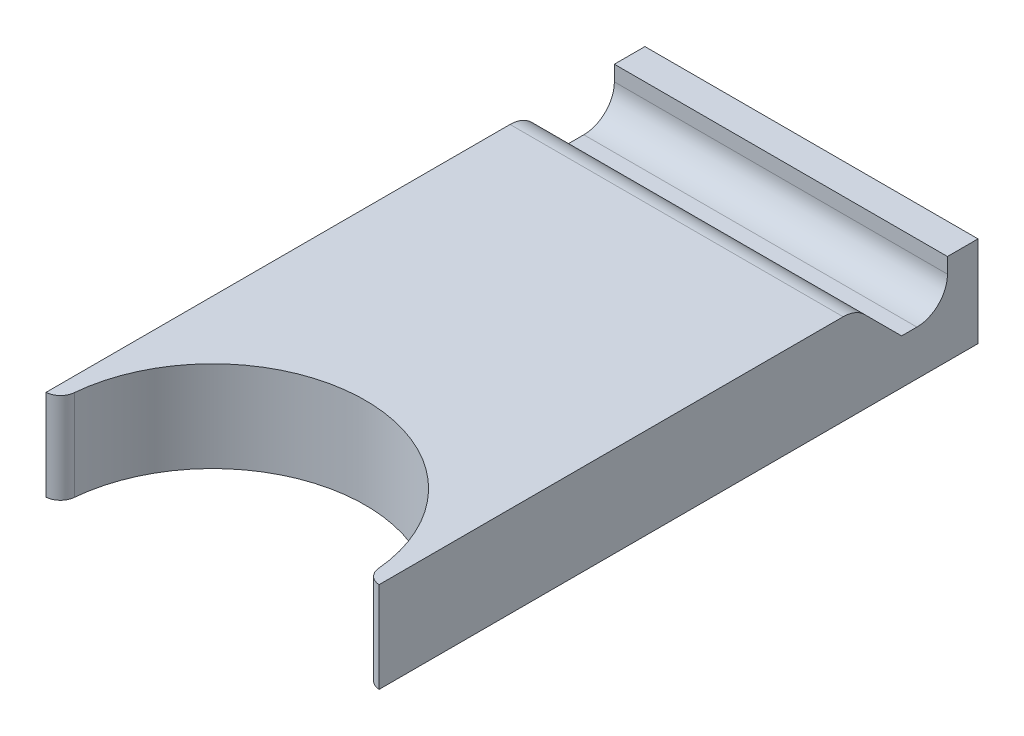
ISO-10303-21;
HEADER;
FILE_DESCRIPTION(('STEP AP214'),'2;1');
FILE_NAME('part.step','',(''),(''),'','','');
FILE_SCHEMA(('AUTOMOTIVE_DESIGN { 1 0 10303 214 1 1 1 1 }'));
ENDSEC;
DATA;
#1=APPLICATION_CONTEXT('core data for automotive mechanical design processes');
#2=APPLICATION_PROTOCOL_DEFINITION('international standard','automotive_design',2000,#1);
#3=PRODUCT_CONTEXT('',#1,'mechanical');
#4=PRODUCT('Part','Part','',(#3));
#5=PRODUCT_RELATED_PRODUCT_CATEGORY('part','',(#4));
#6=PRODUCT_DEFINITION_FORMATION('','',#4);
#7=PRODUCT_DEFINITION_CONTEXT('part definition',#1,'design');
#8=PRODUCT_DEFINITION('design','',#6,#7);
#9=PRODUCT_DEFINITION_SHAPE('','',#8);
#10=(LENGTH_UNIT() NAMED_UNIT(*) SI_UNIT(.MILLI.,.METRE.));
#11=(NAMED_UNIT(*) PLANE_ANGLE_UNIT() SI_UNIT($,.RADIAN.));
#12=(NAMED_UNIT(*) SI_UNIT($,.STERADIAN.) SOLID_ANGLE_UNIT());
#13=UNCERTAINTY_MEASURE_WITH_UNIT(LENGTH_MEASURE(1.E-05),#10,'distance_accuracy_value','');
#14=(GEOMETRIC_REPRESENTATION_CONTEXT(3) GLOBAL_UNCERTAINTY_ASSIGNED_CONTEXT((#13)) GLOBAL_UNIT_ASSIGNED_CONTEXT((#10,
#11,#12)) REPRESENTATION_CONTEXT('',''));
#15=CARTESIAN_POINT('',(0.,0.,0.));
#16=DIRECTION('',(0.,0.,1.));
#17=DIRECTION('',(1.,0.,0.));
#18=AXIS2_PLACEMENT_3D('',#15,#16,#17);
#19=CARTESIAN_POINT('',(0.,2.97,0.));
#20=DIRECTION('',(0.,1.,0.));
#21=DIRECTION('',(0.,0.,1.));
#22=AXIS2_PLACEMENT_3D('',#19,#20,#21);
#23=PLANE('',#22);
#24=DIRECTION('',(-1.,0.,0.));
#25=VECTOR('',#24,1.);
#26=CARTESIAN_POINT('',(-5.45,2.97,-18.6));
#27=LINE('',#26,#25);
#28=CARTESIAN_POINT('',(5.45,2.97,-18.6));
#29=VERTEX_POINT('',#28);
#30=CARTESIAN_POINT('',(-5.45,2.97,-18.6));
#31=VERTEX_POINT('',#30);
#32=EDGE_CURVE('E124',#29,#31,#27,.T.);
#33=ORIENTED_EDGE('',*,*,#32,.F.);
#34=DIRECTION('',(0.,0.,-1.));
#35=VECTOR('',#34,1.);
#36=CARTESIAN_POINT('',(5.45,2.97,0.));
#37=LINE('',#36,#35);
#38=CARTESIAN_POINT('',(5.45,2.97,-19.6));
#39=VERTEX_POINT('',#38);
#40=EDGE_CURVE('E131',#29,#39,#37,.T.);
#41=ORIENTED_EDGE('',*,*,#40,.T.);
#42=DIRECTION('',(-1.,0.,0.));
#43=VECTOR('',#42,1.);
#44=CARTESIAN_POINT('',(-5.45,2.97,-19.6));
#45=LINE('',#44,#43);
#46=CARTESIAN_POINT('',(-5.45,2.97,-19.6));
#47=VERTEX_POINT('',#46);
#48=EDGE_CURVE('E146',#39,#47,#45,.T.);
#49=ORIENTED_EDGE('',*,*,#48,.T.);
#50=DIRECTION('',(0.,0.,1.));
#51=VECTOR('',#50,1.);
#52=CARTESIAN_POINT('',(-5.45,2.97,0.));
#53=LINE('',#52,#51);
#54=EDGE_CURVE('E134',#47,#31,#53,.T.);
#55=ORIENTED_EDGE('',*,*,#54,.T.);
#56=EDGE_LOOP('',(#33,#41,#49,#55));
#57=FACE_BOUND('',#56,.T.);
#58=ADVANCED_FACE('F35',(#57),#23,.T.);
#59=CARTESIAN_POINT('',(-5.45,2.97,0.));
#60=DIRECTION('',(1.,0.,0.));
#61=DIRECTION('',(0.,0.,-1.));
#62=AXIS2_PLACEMENT_3D('',#59,#60,#61);
#63=PLANE('',#62);
#64=CARTESIAN_POINT('',(-5.45,2.97,-15.1857864376269));
#65=VERTEX_POINT('',#64);
#66=CARTESIAN_POINT('',(-5.45,2.97,0.));
#67=VERTEX_POINT('',#66);
#68=EDGE_CURVE('E163',#65,#67,#53,.T.);
#69=ORIENTED_EDGE('',*,*,#68,.F.);
#70=CARTESIAN_POINT('',(-5.45,1.97,-15.1857864376269));
#71=DIRECTION('',(1.,0.,0.));
#72=DIRECTION('',(0.,0.,-1.));
#73=AXIS2_PLACEMENT_3D('',#70,#71,#72);
#74=CIRCLE('',#73,1.);
#75=CARTESIAN_POINT('',(-5.45,2.67710678118654,-15.8928932188134));
#76=VERTEX_POINT('',#75);
#77=EDGE_CURVE('E197',#65,#76,#74,.F.);
#78=ORIENTED_EDGE('',*,*,#77,.T.);
#79=DIRECTION('',(0.,-0.707106781186551,-0.707106781186544));
#80=VECTOR('',#79,1.);
#81=CARTESIAN_POINT('',(-5.45,0.969999999999965,-17.6));
#82=LINE('',#81,#80);
#83=CARTESIAN_POINT('',(-5.45,1.47,-17.1));
#84=VERTEX_POINT('',#83);
#85=EDGE_CURVE('E188',#76,#84,#82,.T.);
#86=ORIENTED_EDGE('',*,*,#85,.T.);
#87=DIRECTION('',(0.,0.,1.));
#88=VECTOR('',#87,1.);
#89=CARTESIAN_POINT('',(-5.45,1.47,-18.6));
#90=LINE('',#89,#88);
#91=CARTESIAN_POINT('',(-5.45,1.47,-17.6));
#92=VERTEX_POINT('',#91);
#93=EDGE_CURVE('E135',#92,#84,#90,.T.);
#94=ORIENTED_EDGE('',*,*,#93,.F.);
#95=CARTESIAN_POINT('',(-5.45,2.47,-17.6));
#96=DIRECTION('',(1.,0.,0.));
#97=DIRECTION('',(0.,0.,-1.));
#98=AXIS2_PLACEMENT_3D('',#95,#96,#97);
#99=CIRCLE('',#98,1.);
#100=CARTESIAN_POINT('',(-5.45,2.47,-18.6));
#101=VERTEX_POINT('',#100);
#102=EDGE_CURVE('E43',#92,#101,#99,.T.);
#103=ORIENTED_EDGE('',*,*,#102,.T.);
#104=DIRECTION('',(0.,1.,0.));
#105=VECTOR('',#104,1.);
#106=CARTESIAN_POINT('',(-5.45,1.47,-18.6));
#107=LINE('',#106,#105);
#108=EDGE_CURVE('E127',#101,#31,#107,.T.);
#109=ORIENTED_EDGE('',*,*,#108,.T.);
#110=ORIENTED_EDGE('',*,*,#54,.F.);
#111=DIRECTION('',(0.,-1.,0.));
#112=VECTOR('',#111,1.);
#113=CARTESIAN_POINT('',(-5.45,2.97,-19.6));
#114=LINE('',#113,#112);
#115=CARTESIAN_POINT('',(-5.45,0.,-19.6));
#116=VERTEX_POINT('',#115);
#117=EDGE_CURVE('E152',#47,#116,#114,.T.);
#118=ORIENTED_EDGE('',*,*,#117,.T.);
#119=DIRECTION('',(0.,0.,1.));
#120=VECTOR('',#119,1.);
#121=CARTESIAN_POINT('',(-5.45,0.,0.));
#122=LINE('',#121,#120);
#123=CARTESIAN_POINT('',(-5.45,0.,0.));
#124=VERTEX_POINT('',#123);
#125=EDGE_CURVE('E153',#116,#124,#122,.T.);
#126=ORIENTED_EDGE('',*,*,#125,.T.);
#127=DIRECTION('',(0.,-1.,0.));
#128=VECTOR('',#127,1.);
#129=CARTESIAN_POINT('',(-5.45,2.97,0.));
#130=LINE('',#129,#128);
#131=EDGE_CURVE('E170',#67,#124,#130,.T.);
#132=ORIENTED_EDGE('',*,*,#131,.F.);
#133=EDGE_LOOP('',(#69,#78,#86,#94,#103,#109,#110,#118,#126,#132));
#134=FACE_BOUND('',#133,.T.);
#135=ADVANCED_FACE('F209',(#134),#63,.F.);
#136=CARTESIAN_POINT('',(0.,2.97,0.));
#137=DIRECTION('',(0.,-1.,0.));
#138=DIRECTION('',(0.,0.,-1.));
#139=AXIS2_PLACEMENT_3D('',#136,#137,#138);
#140=CYLINDRICAL_SURFACE('',#139,5.);
#141=CARTESIAN_POINT('',(0.,0.,0.));
#142=DIRECTION('',(0.,-1.,0.));
#143=DIRECTION('',(0.,0.,1.));
#144=AXIS2_PLACEMENT_3D('',#141,#142,#143);
#145=CIRCLE('',#144,5.);
#146=CARTESIAN_POINT('',(-4.97935779816514,0.,-0.453867731670833));
#147=VERTEX_POINT('',#146);
#148=CARTESIAN_POINT('',(4.97935779816514,0.,-0.453867731670839));
#149=VERTEX_POINT('',#148);
#150=EDGE_CURVE('E156',#147,#149,#145,.T.);
#151=ORIENTED_EDGE('',*,*,#150,.T.);
#152=DIRECTION('',(0.,-1.,0.));
#153=VECTOR('',#152,1.);
#154=CARTESIAN_POINT('',(4.97935779816514,2.97,-0.453867731670839));
#155=LINE('',#154,#153);
#156=CARTESIAN_POINT('',(4.97935779816514,2.97,-0.453867731670839));
#157=VERTEX_POINT('',#156);
#158=EDGE_CURVE('E180',#149,#157,#155,.F.);
#159=ORIENTED_EDGE('',*,*,#158,.T.);
#160=CARTESIAN_POINT('',(0.,2.97,0.));
#161=DIRECTION('',(0.,-1.,0.));
#162=DIRECTION('',(0.,0.,1.));
#163=AXIS2_PLACEMENT_3D('',#160,#161,#162);
#164=CIRCLE('',#163,5.);
#165=CARTESIAN_POINT('',(-4.97935779816514,2.97,-0.453867731670833));
#166=VERTEX_POINT('',#165);
#167=EDGE_CURVE('E143',#166,#157,#164,.T.);
#168=ORIENTED_EDGE('',*,*,#167,.F.);
#169=DIRECTION('',(0.,-1.,0.));
#170=VECTOR('',#169,1.);
#171=CARTESIAN_POINT('',(-4.97935779816514,2.97,-0.453867731670833));
#172=LINE('',#171,#170);
#173=EDGE_CURVE('E177',#166,#147,#172,.T.);
#174=ORIENTED_EDGE('',*,*,#173,.T.);
#175=EDGE_LOOP('',(#151,#159,#168,#174));
#176=FACE_BOUND('',#175,.T.);
#177=ADVANCED_FACE('F231',(#176),#140,.F.);
#178=CARTESIAN_POINT('',(5.45,2.97,0.));
#179=DIRECTION('',(-1.,0.,0.));
#180=DIRECTION('',(0.,0.,1.));
#181=AXIS2_PLACEMENT_3D('',#178,#179,#180);
#182=PLANE('',#181);
#183=DIRECTION('',(0.,0.707106781186551,0.707106781186544));
#184=VECTOR('',#183,1.);
#185=CARTESIAN_POINT('',(5.45,0.969999999999965,-17.6));
#186=LINE('',#185,#184);
#187=CARTESIAN_POINT('',(5.45,1.47,-17.1));
#188=VERTEX_POINT('',#187);
#189=CARTESIAN_POINT('',(5.45,2.67710678118654,-15.8928932188134));
#190=VERTEX_POINT('',#189);
#191=EDGE_CURVE('E186',#188,#190,#186,.T.);
#192=ORIENTED_EDGE('',*,*,#191,.T.);
#193=CARTESIAN_POINT('',(5.45,1.97,-15.1857864376269));
#194=DIRECTION('',(-1.,0.,0.));
#195=DIRECTION('',(0.,0.,1.));
#196=AXIS2_PLACEMENT_3D('',#193,#194,#195);
#197=CIRCLE('',#196,1.);
#198=CARTESIAN_POINT('',(5.45,2.97,-15.1857864376269));
#199=VERTEX_POINT('',#198);
#200=EDGE_CURVE('E201',#190,#199,#197,.F.);
#201=ORIENTED_EDGE('',*,*,#200,.T.);
#202=CARTESIAN_POINT('',(5.45,2.97,0.));
#203=VERTEX_POINT('',#202);
#204=EDGE_CURVE('E142',#203,#199,#37,.T.);
#205=ORIENTED_EDGE('',*,*,#204,.F.);
#206=DIRECTION('',(0.,-1.,0.));
#207=VECTOR('',#206,1.);
#208=CARTESIAN_POINT('',(5.45,2.97,0.));
#209=LINE('',#208,#207);
#210=CARTESIAN_POINT('',(5.45,0.,0.));
#211=VERTEX_POINT('',#210);
#212=EDGE_CURVE('E167',#203,#211,#209,.T.);
#213=ORIENTED_EDGE('',*,*,#212,.T.);
#214=DIRECTION('',(0.,0.,-1.));
#215=VECTOR('',#214,1.);
#216=CARTESIAN_POINT('',(5.45,0.,0.));
#217=LINE('',#216,#215);
#218=CARTESIAN_POINT('',(5.45,0.,-19.6));
#219=VERTEX_POINT('',#218);
#220=EDGE_CURVE('E159',#211,#219,#217,.T.);
#221=ORIENTED_EDGE('',*,*,#220,.T.);
#222=DIRECTION('',(0.,-1.,0.));
#223=VECTOR('',#222,1.);
#224=CARTESIAN_POINT('',(5.45,2.97,-19.6));
#225=LINE('',#224,#223);
#226=EDGE_CURVE('E140',#39,#219,#225,.T.);
#227=ORIENTED_EDGE('',*,*,#226,.F.);
#228=ORIENTED_EDGE('',*,*,#40,.F.);
#229=DIRECTION('',(0.,1.,0.));
#230=VECTOR('',#229,1.);
#231=CARTESIAN_POINT('',(5.45,1.47,-18.6));
#232=LINE('',#231,#230);
#233=CARTESIAN_POINT('',(5.45,2.47,-18.6));
#234=VERTEX_POINT('',#233);
#235=EDGE_CURVE('E121',#234,#29,#232,.T.);
#236=ORIENTED_EDGE('',*,*,#235,.F.);
#237=CARTESIAN_POINT('',(5.45,2.47,-17.6));
#238=DIRECTION('',(-1.,0.,0.));
#239=DIRECTION('',(0.,0.,1.));
#240=AXIS2_PLACEMENT_3D('',#237,#238,#239);
#241=CIRCLE('',#240,1.);
#242=CARTESIAN_POINT('',(5.45,1.47,-17.6));
#243=VERTEX_POINT('',#242);
#244=EDGE_CURVE('E11',#234,#243,#241,.T.);
#245=ORIENTED_EDGE('',*,*,#244,.T.);
#246=DIRECTION('',(0.,0.,-1.));
#247=VECTOR('',#246,1.);
#248=CARTESIAN_POINT('',(5.45,1.47,-18.6));
#249=LINE('',#248,#247);
#250=EDGE_CURVE('E128',#188,#243,#249,.T.);
#251=ORIENTED_EDGE('',*,*,#250,.F.);
#252=EDGE_LOOP('',(#192,#201,#205,#213,#221,#227,#228,#236,#245,#251));
#253=FACE_BOUND('',#252,.T.);
#254=ADVANCED_FACE('F138',(#253),#182,.F.);
#255=CARTESIAN_POINT('',(-5.45,2.97,-19.6));
#256=DIRECTION('',(0.,0.,1.));
#257=DIRECTION('',(1.,0.,0.));
#258=AXIS2_PLACEMENT_3D('',#255,#256,#257);
#259=PLANE('',#258);
#260=DIRECTION('',(-1.,0.,0.));
#261=VECTOR('',#260,1.);
#262=CARTESIAN_POINT('',(-5.45,0.,-19.6));
#263=LINE('',#262,#261);
#264=EDGE_CURVE('E161',#219,#116,#263,.T.);
#265=ORIENTED_EDGE('',*,*,#264,.T.);
#266=ORIENTED_EDGE('',*,*,#117,.F.);
#267=ORIENTED_EDGE('',*,*,#48,.F.);
#268=ORIENTED_EDGE('',*,*,#226,.T.);
#269=EDGE_LOOP('',(#265,#266,#267,#268));
#270=FACE_BOUND('',#269,.T.);
#271=ADVANCED_FACE('F267',(#270),#259,.F.);
#272=ORIENTED_EDGE('',*,*,#204,.T.);
#273=DIRECTION('',(-1.,0.,0.));
#274=VECTOR('',#273,1.);
#275=CARTESIAN_POINT('',(0.,2.97,-15.1857864376269));
#276=LINE('',#275,#274);
#277=EDGE_CURVE('E194',#199,#65,#276,.T.);
#278=ORIENTED_EDGE('',*,*,#277,.T.);
#279=ORIENTED_EDGE('',*,*,#68,.T.);
#280=CARTESIAN_POINT('',(-5.47729357798165,2.97,-0.499254504837917));
#281=DIRECTION('',(0.,1.,0.));
#282=DIRECTION('',(0.,0.,1.));
#283=AXIS2_PLACEMENT_3D('',#280,#281,#282);
#284=CIRCLE('',#283,0.5);
#285=EDGE_CURVE('E182',#67,#166,#284,.T.);
#286=ORIENTED_EDGE('',*,*,#285,.T.);
#287=ORIENTED_EDGE('',*,*,#167,.T.);
#288=CARTESIAN_POINT('',(5.47729357798165,2.97,-0.499254504837923));
#289=DIRECTION('',(0.,1.,0.));
#290=DIRECTION('',(0.,0.,1.));
#291=AXIS2_PLACEMENT_3D('',#288,#289,#290);
#292=CIRCLE('',#291,0.5);
#293=EDGE_CURVE('E184',#157,#203,#292,.T.);
#294=ORIENTED_EDGE('',*,*,#293,.T.);
#295=EDGE_LOOP('',(#272,#278,#279,#286,#287,#294));
#296=FACE_BOUND('',#295,.T.);
#297=ADVANCED_FACE('F221',(#296),#23,.T.);
#298=CARTESIAN_POINT('',(0.,0.,0.));
#299=DIRECTION('',(0.,1.,0.));
#300=DIRECTION('',(0.,0.,1.));
#301=AXIS2_PLACEMENT_3D('',#298,#299,#300);
#302=PLANE('',#301);
#303=ORIENTED_EDGE('',*,*,#220,.F.);
#304=CARTESIAN_POINT('',(5.47729357798165,0.,-0.499254504837923));
#305=DIRECTION('',(0.,1.,0.));
#306=DIRECTION('',(0.,0.,1.));
#307=AXIS2_PLACEMENT_3D('',#304,#305,#306);
#308=CIRCLE('',#307,0.5);
#309=EDGE_CURVE('E175',#211,#149,#308,.F.);
#310=ORIENTED_EDGE('',*,*,#309,.T.);
#311=ORIENTED_EDGE('',*,*,#150,.F.);
#312=CARTESIAN_POINT('',(-5.47729357798165,0.,-0.499254504837917));
#313=DIRECTION('',(0.,1.,0.));
#314=DIRECTION('',(0.,0.,1.));
#315=AXIS2_PLACEMENT_3D('',#312,#313,#314);
#316=CIRCLE('',#315,0.5);
#317=EDGE_CURVE('E173',#147,#124,#316,.F.);
#318=ORIENTED_EDGE('',*,*,#317,.T.);
#319=ORIENTED_EDGE('',*,*,#125,.F.);
#320=ORIENTED_EDGE('',*,*,#264,.F.);
#321=EDGE_LOOP('',(#303,#310,#311,#318,#319,#320));
#322=FACE_BOUND('',#321,.T.);
#323=ADVANCED_FACE('F235',(#322),#302,.F.);
#324=CARTESIAN_POINT('',(5.47729357798165,2.97,-0.499254504837923));
#325=DIRECTION('',(0.,-1.,0.));
#326=DIRECTION('',(0.,0.,-1.));
#327=AXIS2_PLACEMENT_3D('',#324,#325,#326);
#328=CYLINDRICAL_SURFACE('',#327,0.5);
#329=ORIENTED_EDGE('',*,*,#293,.F.);
#330=ORIENTED_EDGE('',*,*,#158,.F.);
#331=ORIENTED_EDGE('',*,*,#309,.F.);
#332=ORIENTED_EDGE('',*,*,#212,.F.);
#333=EDGE_LOOP('',(#329,#330,#331,#332));
#334=FACE_BOUND('',#333,.T.);
#335=ADVANCED_FACE('F240',(#334),#328,.T.);
#336=CARTESIAN_POINT('',(-5.47729357798165,2.97,-0.499254504837917));
#337=DIRECTION('',(0.,-1.,0.));
#338=DIRECTION('',(0.,0.,-1.));
#339=AXIS2_PLACEMENT_3D('',#336,#337,#338);
#340=CYLINDRICAL_SURFACE('',#339,0.5);
#341=ORIENTED_EDGE('',*,*,#285,.F.);
#342=ORIENTED_EDGE('',*,*,#131,.T.);
#343=ORIENTED_EDGE('',*,*,#317,.F.);
#344=ORIENTED_EDGE('',*,*,#173,.F.);
#345=EDGE_LOOP('',(#341,#342,#343,#344));
#346=FACE_BOUND('',#345,.T.);
#347=ADVANCED_FACE('F228',(#346),#340,.T.);
#348=CARTESIAN_POINT('',(-5.45,1.47,-18.6));
#349=DIRECTION('',(0.,0.,-1.));
#350=DIRECTION('',(-1.,0.,0.));
#351=AXIS2_PLACEMENT_3D('',#348,#349,#350);
#352=PLANE('',#351);
#353=ORIENTED_EDGE('',*,*,#108,.F.);
#354=DIRECTION('',(-1.,0.,0.));
#355=VECTOR('',#354,1.);
#356=CARTESIAN_POINT('',(-5.45,2.47,-18.6));
#357=LINE('',#356,#355);
#358=EDGE_CURVE('E50',#101,#234,#357,.F.);
#359=ORIENTED_EDGE('',*,*,#358,.T.);
#360=ORIENTED_EDGE('',*,*,#235,.T.);
#361=ORIENTED_EDGE('',*,*,#32,.T.);
#362=EDGE_LOOP('',(#353,#359,#360,#361));
#363=FACE_BOUND('',#362,.T.);
#364=ADVANCED_FACE('F123',(#363),#352,.F.);
#365=CARTESIAN_POINT('',(0.,1.47,0.));
#366=DIRECTION('',(0.,1.,0.));
#367=DIRECTION('',(0.,0.,1.));
#368=AXIS2_PLACEMENT_3D('',#365,#366,#367);
#369=PLANE('',#368);
#370=ORIENTED_EDGE('',*,*,#250,.T.);
#371=DIRECTION('',(-1.,0.,0.));
#372=VECTOR('',#371,1.);
#373=CARTESIAN_POINT('',(0.,1.47,-17.6));
#374=LINE('',#373,#372);
#375=EDGE_CURVE('E203',#243,#92,#374,.T.);
#376=ORIENTED_EDGE('',*,*,#375,.T.);
#377=ORIENTED_EDGE('',*,*,#93,.T.);
#378=DIRECTION('',(1.,0.,0.));
#379=VECTOR('',#378,1.);
#380=CARTESIAN_POINT('',(-5.45,1.47,-17.1));
#381=LINE('',#380,#379);
#382=EDGE_CURVE('E191',#84,#188,#381,.T.);
#383=ORIENTED_EDGE('',*,*,#382,.T.);
#384=EDGE_LOOP('',(#370,#376,#377,#383));
#385=FACE_BOUND('',#384,.T.);
#386=ADVANCED_FACE('F214',(#385),#369,.T.);
#387=CARTESIAN_POINT('',(-5.45,0.969999999999965,-17.6));
#388=DIRECTION('',(0.,0.707106781186544,-0.707106781186551));
#389=DIRECTION('',(-1.,0.,0.));
#390=AXIS2_PLACEMENT_3D('',#387,#388,#389);
#391=PLANE('',#390);
#392=ORIENTED_EDGE('',*,*,#85,.F.);
#393=DIRECTION('',(-1.,0.,0.));
#394=VECTOR('',#393,1.);
#395=CARTESIAN_POINT('',(-5.45,2.67710678118654,-15.8928932188134));
#396=LINE('',#395,#394);
#397=EDGE_CURVE('E199',#76,#190,#396,.F.);
#398=ORIENTED_EDGE('',*,*,#397,.T.);
#399=ORIENTED_EDGE('',*,*,#191,.F.);
#400=ORIENTED_EDGE('',*,*,#382,.F.);
#401=EDGE_LOOP('',(#392,#398,#399,#400));
#402=FACE_BOUND('',#401,.T.);
#403=ADVANCED_FACE('F248',(#402),#391,.T.);
#404=CARTESIAN_POINT('',(0.,1.97,-15.1857864376269));
#405=DIRECTION('',(-1.,0.,0.));
#406=DIRECTION('',(0.,0.,1.));
#407=AXIS2_PLACEMENT_3D('',#404,#405,#406);
#408=CYLINDRICAL_SURFACE('',#407,1.);
#409=ORIENTED_EDGE('',*,*,#200,.F.);
#410=ORIENTED_EDGE('',*,*,#397,.F.);
#411=ORIENTED_EDGE('',*,*,#77,.F.);
#412=ORIENTED_EDGE('',*,*,#277,.F.);
#413=EDGE_LOOP('',(#409,#410,#411,#412));
#414=FACE_BOUND('',#413,.T.);
#415=ADVANCED_FACE('F244',(#414),#408,.T.);
#416=CARTESIAN_POINT('',(0.,2.47,-17.6));
#417=DIRECTION('',(-1.,0.,0.));
#418=DIRECTION('',(0.,0.,1.));
#419=AXIS2_PLACEMENT_3D('',#416,#417,#418);
#420=CYLINDRICAL_SURFACE('',#419,1.);
#421=ORIENTED_EDGE('',*,*,#244,.F.);
#422=ORIENTED_EDGE('',*,*,#358,.F.);
#423=ORIENTED_EDGE('',*,*,#102,.F.);
#424=ORIENTED_EDGE('',*,*,#375,.F.);
#425=EDGE_LOOP('',(#421,#422,#423,#424));
#426=FACE_BOUND('',#425,.T.);
#427=ADVANCED_FACE('F37',(#426),#420,.F.);
#428=CLOSED_SHELL('',(#58,#135,#177,#254,#271,#297,#323,#335,#347,#364,#386,#403,#415,#427));
#429=MANIFOLD_SOLID_BREP('B2',#428);
#430=ADVANCED_BREP_SHAPE_REPRESENTATION('',(#18,#429),#14);
#431=SHAPE_DEFINITION_REPRESENTATION(#9,#430);
ENDSEC;
END-ISO-10303-21;
